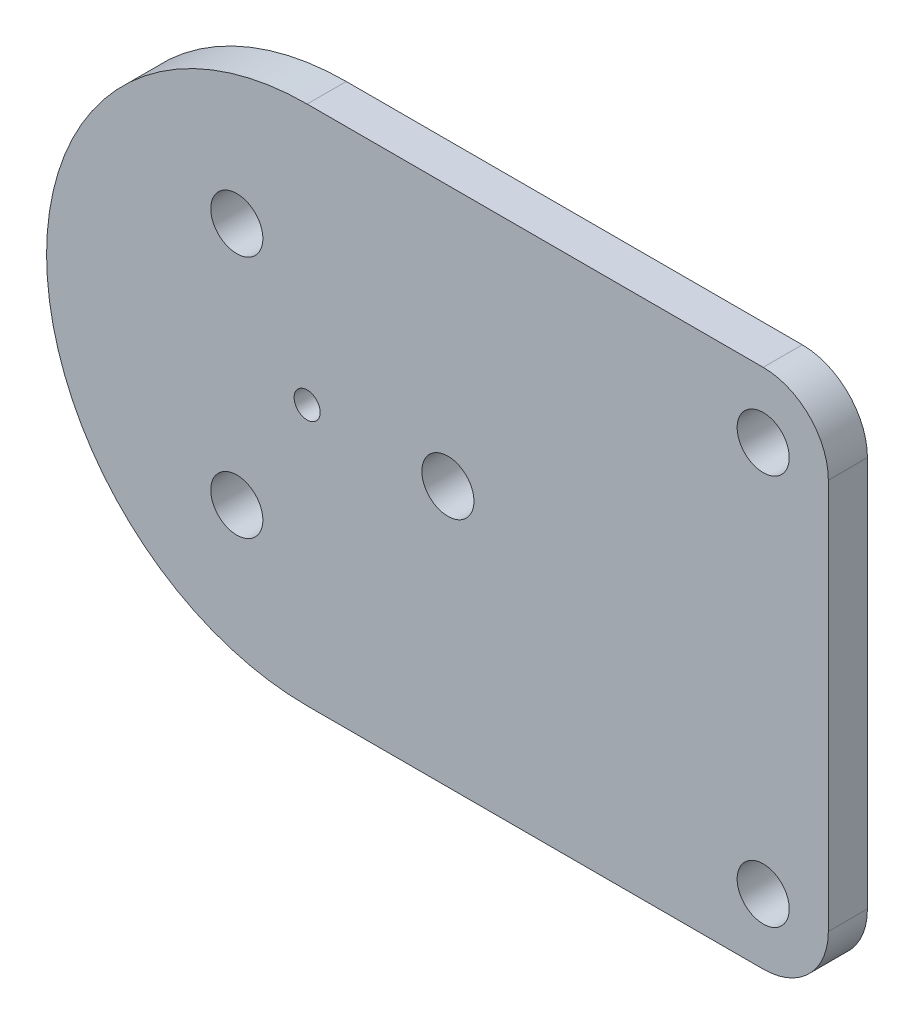
ISO-10303-21;
HEADER;
FILE_DESCRIPTION(('STEP AP214'),'2;1');
FILE_NAME('part.step','',(''),(''),'','','');
FILE_SCHEMA(('AUTOMOTIVE_DESIGN { 1 0 10303 214 1 1 1 1 }'));
ENDSEC;
DATA;
#1=APPLICATION_CONTEXT('core data for automotive mechanical design processes');
#2=APPLICATION_PROTOCOL_DEFINITION('international standard','automotive_design',2000,#1);
#3=PRODUCT_CONTEXT('',#1,'mechanical');
#4=PRODUCT('Part','Part','',(#3));
#5=PRODUCT_RELATED_PRODUCT_CATEGORY('part','',(#4));
#6=PRODUCT_DEFINITION_FORMATION('','',#4);
#7=PRODUCT_DEFINITION_CONTEXT('part definition',#1,'design');
#8=PRODUCT_DEFINITION('design','',#6,#7);
#9=PRODUCT_DEFINITION_SHAPE('','',#8);
#10=(LENGTH_UNIT() NAMED_UNIT(*) SI_UNIT(.MILLI.,.METRE.));
#11=(NAMED_UNIT(*) PLANE_ANGLE_UNIT() SI_UNIT($,.RADIAN.));
#12=(NAMED_UNIT(*) SI_UNIT($,.STERADIAN.) SOLID_ANGLE_UNIT());
#13=UNCERTAINTY_MEASURE_WITH_UNIT(LENGTH_MEASURE(1.E-05),#10,'distance_accuracy_value','');
#14=(GEOMETRIC_REPRESENTATION_CONTEXT(3) GLOBAL_UNCERTAINTY_ASSIGNED_CONTEXT((#13)) GLOBAL_UNIT_ASSIGNED_CONTEXT((#10,
#11,#12)) REPRESENTATION_CONTEXT('',''));
#15=CARTESIAN_POINT('',(0.,0.,0.));
#16=DIRECTION('',(0.,0.,1.));
#17=DIRECTION('',(1.,0.,0.));
#18=AXIS2_PLACEMENT_3D('',#15,#16,#17);
#19=CARTESIAN_POINT('',(0.,-20.,3.));
#20=DIRECTION('',(0.,1.,0.));
#21=DIRECTION('',(0.,0.,1.));
#22=AXIS2_PLACEMENT_3D('',#19,#20,#21);
#23=PLANE('',#22);
#24=DIRECTION('',(1.,0.,0.));
#25=VECTOR('',#24,1.);
#26=CARTESIAN_POINT('',(0.,-20.,0.));
#27=LINE('',#26,#25);
#28=CARTESIAN_POINT('',(0.,-20.,0.));
#29=VERTEX_POINT('',#28);
#30=CARTESIAN_POINT('',(35.,-20.,0.));
#31=VERTEX_POINT('',#30);
#32=EDGE_CURVE('E147',#29,#31,#27,.T.);
#33=ORIENTED_EDGE('',*,*,#32,.T.);
#34=DIRECTION('',(0.,0.,-1.));
#35=VECTOR('',#34,1.);
#36=CARTESIAN_POINT('',(35.,-20.,3.));
#37=LINE('',#36,#35);
#38=CARTESIAN_POINT('',(35.,-20.,3.));
#39=VERTEX_POINT('',#38);
#40=EDGE_CURVE('E68',#31,#39,#37,.F.);
#41=ORIENTED_EDGE('',*,*,#40,.T.);
#42=DIRECTION('',(1.,0.,0.));
#43=VECTOR('',#42,1.);
#44=CARTESIAN_POINT('',(0.,-20.,3.));
#45=LINE('',#44,#43);
#46=CARTESIAN_POINT('',(0.,-20.,3.));
#47=VERTEX_POINT('',#46);
#48=EDGE_CURVE('E134',#47,#39,#45,.T.);
#49=ORIENTED_EDGE('',*,*,#48,.F.);
#50=DIRECTION('',(0.,0.,-1.));
#51=VECTOR('',#50,1.);
#52=CARTESIAN_POINT('',(0.,-20.,3.));
#53=LINE('',#52,#51);
#54=EDGE_CURVE('E116',#47,#29,#53,.T.);
#55=ORIENTED_EDGE('',*,*,#54,.T.);
#56=EDGE_LOOP('',(#33,#41,#49,#55));
#57=FACE_BOUND('',#56,.T.);
#58=ADVANCED_FACE('F45',(#57),#23,.F.);
#59=CARTESIAN_POINT('',(40.,0.,3.));
#60=DIRECTION('',(1.,0.,0.));
#61=DIRECTION('',(0.,0.,-1.));
#62=AXIS2_PLACEMENT_3D('',#59,#60,#61);
#63=PLANE('',#62);
#64=DIRECTION('',(0.,-1.,0.));
#65=VECTOR('',#64,1.);
#66=CARTESIAN_POINT('',(40.,0.,3.));
#67=LINE('',#66,#65);
#68=CARTESIAN_POINT('',(40.,15.,3.));
#69=VERTEX_POINT('',#68);
#70=CARTESIAN_POINT('',(40.,-15.,3.));
#71=VERTEX_POINT('',#70);
#72=EDGE_CURVE('E128',#69,#71,#67,.T.);
#73=ORIENTED_EDGE('',*,*,#72,.T.);
#74=DIRECTION('',(0.,0.,-1.));
#75=VECTOR('',#74,1.);
#76=CARTESIAN_POINT('',(40.,-15.,0.));
#77=LINE('',#76,#75);
#78=CARTESIAN_POINT('',(40.,-15.,0.));
#79=VERTEX_POINT('',#78);
#80=EDGE_CURVE('E171',#71,#79,#77,.T.);
#81=ORIENTED_EDGE('',*,*,#80,.T.);
#82=DIRECTION('',(0.,-1.,0.));
#83=VECTOR('',#82,1.);
#84=CARTESIAN_POINT('',(40.,0.,0.));
#85=LINE('',#84,#83);
#86=CARTESIAN_POINT('',(40.,15.,0.));
#87=VERTEX_POINT('',#86);
#88=EDGE_CURVE('E150',#87,#79,#85,.T.);
#89=ORIENTED_EDGE('',*,*,#88,.F.);
#90=DIRECTION('',(0.,0.,-1.));
#91=VECTOR('',#90,1.);
#92=CARTESIAN_POINT('',(40.,15.,3.));
#93=LINE('',#92,#91);
#94=EDGE_CURVE('E115',#87,#69,#93,.F.);
#95=ORIENTED_EDGE('',*,*,#94,.T.);
#96=EDGE_LOOP('',(#73,#81,#89,#95));
#97=FACE_BOUND('',#96,.T.);
#98=ADVANCED_FACE('F183',(#97),#63,.T.);
#99=CARTESIAN_POINT('',(0.,20.,3.));
#100=DIRECTION('',(0.,1.,0.));
#101=DIRECTION('',(0.,0.,1.));
#102=AXIS2_PLACEMENT_3D('',#99,#100,#101);
#103=PLANE('',#102);
#104=DIRECTION('',(1.,0.,0.));
#105=VECTOR('',#104,1.);
#106=CARTESIAN_POINT('',(0.,20.,3.));
#107=LINE('',#106,#105);
#108=CARTESIAN_POINT('',(0.,20.,3.));
#109=VERTEX_POINT('',#108);
#110=CARTESIAN_POINT('',(35.,20.,3.));
#111=VERTEX_POINT('',#110);
#112=EDGE_CURVE('E108',#109,#111,#107,.T.);
#113=ORIENTED_EDGE('',*,*,#112,.T.);
#114=DIRECTION('',(0.,0.,-1.));
#115=VECTOR('',#114,1.);
#116=CARTESIAN_POINT('',(35.,20.,3.));
#117=LINE('',#116,#115);
#118=CARTESIAN_POINT('',(35.,20.,0.));
#119=VERTEX_POINT('',#118);
#120=EDGE_CURVE('E11',#111,#119,#117,.T.);
#121=ORIENTED_EDGE('',*,*,#120,.T.);
#122=DIRECTION('',(1.,0.,0.));
#123=VECTOR('',#122,1.);
#124=CARTESIAN_POINT('',(0.,20.,0.));
#125=LINE('',#124,#123);
#126=CARTESIAN_POINT('',(0.,20.,0.));
#127=VERTEX_POINT('',#126);
#128=EDGE_CURVE('E111',#127,#119,#125,.T.);
#129=ORIENTED_EDGE('',*,*,#128,.F.);
#130=DIRECTION('',(0.,0.,-1.));
#131=VECTOR('',#130,1.);
#132=CARTESIAN_POINT('',(0.,20.,3.));
#133=LINE('',#132,#131);
#134=EDGE_CURVE('E105',#109,#127,#133,.T.);
#135=ORIENTED_EDGE('',*,*,#134,.F.);
#136=EDGE_LOOP('',(#113,#121,#129,#135));
#137=FACE_BOUND('',#136,.T.);
#138=ADVANCED_FACE('F107',(#137),#103,.T.);
#139=CARTESIAN_POINT('',(35.,-15.,3.));
#140=DIRECTION('',(0.,0.,-1.));
#141=DIRECTION('',(-1.,0.,0.));
#142=AXIS2_PLACEMENT_3D('',#139,#140,#141);
#143=CYLINDRICAL_SURFACE('',#142,2.);
#144=CARTESIAN_POINT('',(35.,-15.,3.));
#145=DIRECTION('',(0.,0.,1.));
#146=DIRECTION('',(1.,0.,0.));
#147=AXIS2_PLACEMENT_3D('',#144,#145,#146);
#148=CIRCLE('',#147,2.);
#149=CARTESIAN_POINT('',(37.,-15.,3.));
#150=VERTEX_POINT('',#149);
#151=EDGE_CURVE('E141',#150,#150,#148,.T.);
#152=ORIENTED_EDGE('',*,*,#151,.T.);
#153=EDGE_LOOP('',(#152));
#154=FACE_BOUND('',#153,.T.);
#155=CARTESIAN_POINT('',(35.,-15.,0.));
#156=DIRECTION('',(0.,0.,1.));
#157=DIRECTION('',(1.,0.,0.));
#158=AXIS2_PLACEMENT_3D('',#155,#156,#157);
#159=CIRCLE('',#158,2.);
#160=CARTESIAN_POINT('',(37.,-15.,0.));
#161=VERTEX_POINT('',#160);
#162=EDGE_CURVE('E162',#161,#161,#159,.T.);
#163=ORIENTED_EDGE('',*,*,#162,.F.);
#164=EDGE_LOOP('',(#163));
#165=FACE_BOUND('',#164,.T.);
#166=ADVANCED_FACE('F293',(#154,#165),#143,.F.);
#167=CARTESIAN_POINT('',(0.,0.,3.));
#168=DIRECTION('',(0.,0.,-1.));
#169=DIRECTION('',(-1.,0.,0.));
#170=AXIS2_PLACEMENT_3D('',#167,#168,#169);
#171=CYLINDRICAL_SURFACE('',#170,1.);
#172=CARTESIAN_POINT('',(0.,0.,3.));
#173=DIRECTION('',(0.,0.,1.));
#174=DIRECTION('',(1.,0.,0.));
#175=AXIS2_PLACEMENT_3D('',#172,#173,#174);
#176=CIRCLE('',#175,1.);
#177=CARTESIAN_POINT('',(1.,0.,3.));
#178=VERTEX_POINT('',#177);
#179=EDGE_CURVE('E123',#178,#178,#176,.T.);
#180=ORIENTED_EDGE('',*,*,#179,.T.);
#181=EDGE_LOOP('',(#180));
#182=FACE_BOUND('',#181,.T.);
#183=CARTESIAN_POINT('',(0.,0.,0.));
#184=DIRECTION('',(0.,0.,1.));
#185=DIRECTION('',(1.,0.,0.));
#186=AXIS2_PLACEMENT_3D('',#183,#184,#185);
#187=CIRCLE('',#186,1.);
#188=CARTESIAN_POINT('',(1.,0.,0.));
#189=VERTEX_POINT('',#188);
#190=EDGE_CURVE('E158',#189,#189,#187,.T.);
#191=ORIENTED_EDGE('',*,*,#190,.F.);
#192=EDGE_LOOP('',(#191));
#193=FACE_BOUND('',#192,.T.);
#194=ADVANCED_FACE('F344',(#182,#193),#171,.F.);
#195=CARTESIAN_POINT('',(0.,0.,3.));
#196=DIRECTION('',(0.,0.,-1.));
#197=DIRECTION('',(-1.,0.,0.));
#198=AXIS2_PLACEMENT_3D('',#195,#196,#197);
#199=CYLINDRICAL_SURFACE('',#198,20.);
#200=CARTESIAN_POINT('',(0.,0.,0.));
#201=DIRECTION('',(0.,0.,1.));
#202=DIRECTION('',(1.,0.,0.));
#203=AXIS2_PLACEMENT_3D('',#200,#201,#202);
#204=CIRCLE('',#203,20.);
#205=EDGE_CURVE('E155',#127,#29,#204,.T.);
#206=ORIENTED_EDGE('',*,*,#205,.T.);
#207=ORIENTED_EDGE('',*,*,#54,.F.);
#208=CARTESIAN_POINT('',(0.,0.,3.));
#209=DIRECTION('',(0.,0.,1.));
#210=DIRECTION('',(1.,0.,0.));
#211=AXIS2_PLACEMENT_3D('',#208,#209,#210);
#212=CIRCLE('',#211,20.);
#213=EDGE_CURVE('E119',#109,#47,#212,.T.);
#214=ORIENTED_EDGE('',*,*,#213,.F.);
#215=ORIENTED_EDGE('',*,*,#134,.T.);
#216=EDGE_LOOP('',(#206,#207,#214,#215));
#217=FACE_BOUND('',#216,.T.);
#218=ADVANCED_FACE('F120',(#217),#199,.T.);
#219=CARTESIAN_POINT('',(35.,15.,3.));
#220=DIRECTION('',(0.,0.,-1.));
#221=DIRECTION('',(-1.,0.,0.));
#222=AXIS2_PLACEMENT_3D('',#219,#220,#221);
#223=CYLINDRICAL_SURFACE('',#222,2.);
#224=CARTESIAN_POINT('',(35.,15.,3.));
#225=DIRECTION('',(0.,0.,1.));
#226=DIRECTION('',(1.,0.,0.));
#227=AXIS2_PLACEMENT_3D('',#224,#225,#226);
#228=CIRCLE('',#227,2.);
#229=CARTESIAN_POINT('',(37.,15.,3.));
#230=VERTEX_POINT('',#229);
#231=EDGE_CURVE('E144',#230,#230,#228,.F.);
#232=ORIENTED_EDGE('',*,*,#231,.F.);
#233=EDGE_LOOP('',(#232));
#234=FACE_BOUND('',#233,.T.);
#235=CARTESIAN_POINT('',(35.,15.,0.));
#236=DIRECTION('',(0.,0.,1.));
#237=DIRECTION('',(1.,0.,0.));
#238=AXIS2_PLACEMENT_3D('',#235,#236,#237);
#239=CIRCLE('',#238,2.);
#240=CARTESIAN_POINT('',(37.,15.,0.));
#241=VERTEX_POINT('',#240);
#242=EDGE_CURVE('E165',#241,#241,#239,.F.);
#243=ORIENTED_EDGE('',*,*,#242,.T.);
#244=EDGE_LOOP('',(#243));
#245=FACE_BOUND('',#244,.T.);
#246=ADVANCED_FACE('F283',(#234,#245),#223,.F.);
#247=CARTESIAN_POINT('',(0.,0.,3.));
#248=DIRECTION('',(0.,0.,1.));
#249=DIRECTION('',(1.,0.,0.));
#250=AXIS2_PLACEMENT_3D('',#247,#248,#249);
#251=PLANE('',#250);
#252=CARTESIAN_POINT('',(10.8,0.,3.));
#253=DIRECTION('',(0.,0.,-1.));
#254=DIRECTION('',(-1.,0.,0.));
#255=AXIS2_PLACEMENT_3D('',#252,#253,#254);
#256=CIRCLE('',#255,2.);
#257=CARTESIAN_POINT('',(8.8,0.,3.));
#258=VERTEX_POINT('',#257);
#259=EDGE_CURVE('E151',#258,#258,#256,.T.);
#260=ORIENTED_EDGE('',*,*,#259,.T.);
#261=EDGE_LOOP('',(#260));
#262=FACE_BOUND('',#261,.T.);
#263=CARTESIAN_POINT('',(-5.40000000000005,9.35307436087191,3.));
#264=DIRECTION('',(0.,0.,-1.));
#265=DIRECTION('',(-1.,0.,0.));
#266=AXIS2_PLACEMENT_3D('',#263,#264,#265);
#267=CIRCLE('',#266,2.);
#268=CARTESIAN_POINT('',(-7.40000000000005,9.35307436087191,3.));
#269=VERTEX_POINT('',#268);
#270=EDGE_CURVE('E201',#269,#269,#267,.T.);
#271=ORIENTED_EDGE('',*,*,#270,.T.);
#272=EDGE_LOOP('',(#271));
#273=FACE_BOUND('',#272,.T.);
#274=CARTESIAN_POINT('',(-5.39999999999992,-9.35307436087199,3.));
#275=DIRECTION('',(0.,0.,-1.));
#276=DIRECTION('',(-1.,0.,0.));
#277=AXIS2_PLACEMENT_3D('',#274,#275,#276);
#278=CIRCLE('',#277,2.);
#279=CARTESIAN_POINT('',(-7.39999999999992,-9.35307436087199,3.));
#280=VERTEX_POINT('',#279);
#281=EDGE_CURVE('E193',#280,#280,#278,.T.);
#282=ORIENTED_EDGE('',*,*,#281,.T.);
#283=EDGE_LOOP('',(#282));
#284=FACE_BOUND('',#283,.T.);
#285=ORIENTED_EDGE('',*,*,#48,.T.);
#286=CARTESIAN_POINT('',(35.,-15.,3.));
#287=DIRECTION('',(0.,0.,1.));
#288=DIRECTION('',(1.,0.,0.));
#289=AXIS2_PLACEMENT_3D('',#286,#287,#288);
#290=CIRCLE('',#289,5.);
#291=EDGE_CURVE('E53',#39,#71,#290,.T.);
#292=ORIENTED_EDGE('',*,*,#291,.T.);
#293=ORIENTED_EDGE('',*,*,#72,.F.);
#294=CARTESIAN_POINT('',(35.,15.,3.));
#295=DIRECTION('',(0.,0.,1.));
#296=DIRECTION('',(1.,0.,0.));
#297=AXIS2_PLACEMENT_3D('',#294,#295,#296);
#298=CIRCLE('',#297,5.);
#299=EDGE_CURVE('E60',#69,#111,#298,.T.);
#300=ORIENTED_EDGE('',*,*,#299,.T.);
#301=ORIENTED_EDGE('',*,*,#112,.F.);
#302=ORIENTED_EDGE('',*,*,#213,.T.);
#303=EDGE_LOOP('',(#285,#292,#293,#300,#301,#302));
#304=FACE_BOUND('',#303,.T.);
#305=ORIENTED_EDGE('',*,*,#179,.F.);
#306=EDGE_LOOP('',(#305));
#307=FACE_BOUND('',#306,.T.);
#308=ORIENTED_EDGE('',*,*,#151,.F.);
#309=EDGE_LOOP('',(#308));
#310=FACE_BOUND('',#309,.T.);
#311=ORIENTED_EDGE('',*,*,#231,.T.);
#312=EDGE_LOOP('',(#311));
#313=FACE_BOUND('',#312,.T.);
#314=ADVANCED_FACE('F125',(#262,#273,#284,#304,#307,#310,#313),#251,.T.);
#315=CARTESIAN_POINT('',(0.,0.,0.));
#316=DIRECTION('',(0.,0.,1.));
#317=DIRECTION('',(1.,0.,0.));
#318=AXIS2_PLACEMENT_3D('',#315,#316,#317);
#319=PLANE('',#318);
#320=CARTESIAN_POINT('',(10.8,0.,0.));
#321=DIRECTION('',(0.,0.,-1.));
#322=DIRECTION('',(-1.,0.,0.));
#323=AXIS2_PLACEMENT_3D('',#320,#321,#322);
#324=CIRCLE('',#323,2.);
#325=CARTESIAN_POINT('',(8.8,0.,0.));
#326=VERTEX_POINT('',#325);
#327=EDGE_CURVE('E209',#326,#326,#324,.T.);
#328=ORIENTED_EDGE('',*,*,#327,.F.);
#329=EDGE_LOOP('',(#328));
#330=FACE_BOUND('',#329,.T.);
#331=CARTESIAN_POINT('',(-5.40000000000005,9.35307436087191,0.));
#332=DIRECTION('',(0.,0.,-1.));
#333=DIRECTION('',(-1.,0.,0.));
#334=AXIS2_PLACEMENT_3D('',#331,#332,#333);
#335=CIRCLE('',#334,2.);
#336=CARTESIAN_POINT('',(-7.40000000000005,9.35307436087191,0.));
#337=VERTEX_POINT('',#336);
#338=EDGE_CURVE('E205',#337,#337,#335,.T.);
#339=ORIENTED_EDGE('',*,*,#338,.F.);
#340=EDGE_LOOP('',(#339));
#341=FACE_BOUND('',#340,.T.);
#342=CARTESIAN_POINT('',(-5.39999999999992,-9.35307436087199,0.));
#343=DIRECTION('',(0.,0.,-1.));
#344=DIRECTION('',(-1.,0.,0.));
#345=AXIS2_PLACEMENT_3D('',#342,#343,#344);
#346=CIRCLE('',#345,2.);
#347=CARTESIAN_POINT('',(-7.39999999999992,-9.35307436087199,0.));
#348=VERTEX_POINT('',#347);
#349=EDGE_CURVE('E197',#348,#348,#346,.T.);
#350=ORIENTED_EDGE('',*,*,#349,.F.);
#351=EDGE_LOOP('',(#350));
#352=FACE_BOUND('',#351,.T.);
#353=ORIENTED_EDGE('',*,*,#88,.T.);
#354=CARTESIAN_POINT('',(35.,-15.,0.));
#355=DIRECTION('',(0.,0.,1.));
#356=DIRECTION('',(1.,0.,0.));
#357=AXIS2_PLACEMENT_3D('',#354,#355,#356);
#358=CIRCLE('',#357,5.);
#359=EDGE_CURVE('E176',#79,#31,#358,.F.);
#360=ORIENTED_EDGE('',*,*,#359,.T.);
#361=ORIENTED_EDGE('',*,*,#32,.F.);
#362=ORIENTED_EDGE('',*,*,#205,.F.);
#363=ORIENTED_EDGE('',*,*,#128,.T.);
#364=CARTESIAN_POINT('',(35.,15.,0.));
#365=DIRECTION('',(0.,0.,1.));
#366=DIRECTION('',(1.,0.,0.));
#367=AXIS2_PLACEMENT_3D('',#364,#365,#366);
#368=CIRCLE('',#367,5.);
#369=EDGE_CURVE('E174',#119,#87,#368,.F.);
#370=ORIENTED_EDGE('',*,*,#369,.T.);
#371=EDGE_LOOP('',(#353,#360,#361,#362,#363,#370));
#372=FACE_BOUND('',#371,.T.);
#373=ORIENTED_EDGE('',*,*,#190,.T.);
#374=EDGE_LOOP('',(#373));
#375=FACE_BOUND('',#374,.T.);
#376=ORIENTED_EDGE('',*,*,#162,.T.);
#377=EDGE_LOOP('',(#376));
#378=FACE_BOUND('',#377,.T.);
#379=ORIENTED_EDGE('',*,*,#242,.F.);
#380=EDGE_LOOP('',(#379));
#381=FACE_BOUND('',#380,.T.);
#382=ADVANCED_FACE('F189',(#330,#341,#352,#372,#375,#378,#381),#319,.F.);
#383=CARTESIAN_POINT('',(-5.39999999999992,-9.35307436087199,3.));
#384=DIRECTION('',(0.,0.,-1.));
#385=DIRECTION('',(-1.,0.,0.));
#386=AXIS2_PLACEMENT_3D('',#383,#384,#385);
#387=CYLINDRICAL_SURFACE('',#386,2.);
#388=ORIENTED_EDGE('',*,*,#281,.F.);
#389=EDGE_LOOP('',(#388));
#390=FACE_BOUND('',#389,.T.);
#391=ORIENTED_EDGE('',*,*,#349,.T.);
#392=EDGE_LOOP('',(#391));
#393=FACE_BOUND('',#392,.T.);
#394=ADVANCED_FACE('F228',(#390,#393),#387,.F.);
#395=CARTESIAN_POINT('',(-5.40000000000005,9.35307436087191,3.));
#396=DIRECTION('',(0.,0.,-1.));
#397=DIRECTION('',(-1.,0.,0.));
#398=AXIS2_PLACEMENT_3D('',#395,#396,#397);
#399=CYLINDRICAL_SURFACE('',#398,2.);
#400=ORIENTED_EDGE('',*,*,#270,.F.);
#401=EDGE_LOOP('',(#400));
#402=FACE_BOUND('',#401,.T.);
#403=ORIENTED_EDGE('',*,*,#338,.T.);
#404=EDGE_LOOP('',(#403));
#405=FACE_BOUND('',#404,.T.);
#406=ADVANCED_FACE('F222',(#402,#405),#399,.F.);
#407=CARTESIAN_POINT('',(10.8,0.,3.));
#408=DIRECTION('',(0.,0.,-1.));
#409=DIRECTION('',(-1.,0.,0.));
#410=AXIS2_PLACEMENT_3D('',#407,#408,#409);
#411=CYLINDRICAL_SURFACE('',#410,2.);
#412=ORIENTED_EDGE('',*,*,#259,.F.);
#413=EDGE_LOOP('',(#412));
#414=FACE_BOUND('',#413,.T.);
#415=ORIENTED_EDGE('',*,*,#327,.T.);
#416=EDGE_LOOP('',(#415));
#417=FACE_BOUND('',#416,.T.);
#418=ADVANCED_FACE('F219',(#414,#417),#411,.F.);
#419=CARTESIAN_POINT('',(35.,-15.,3.));
#420=DIRECTION('',(0.,0.,1.));
#421=DIRECTION('',(1.,0.,0.));
#422=AXIS2_PLACEMENT_3D('',#419,#420,#421);
#423=CYLINDRICAL_SURFACE('',#422,5.);
#424=ORIENTED_EDGE('',*,*,#291,.F.);
#425=ORIENTED_EDGE('',*,*,#40,.F.);
#426=ORIENTED_EDGE('',*,*,#359,.F.);
#427=ORIENTED_EDGE('',*,*,#80,.F.);
#428=EDGE_LOOP('',(#424,#425,#426,#427));
#429=FACE_BOUND('',#428,.T.);
#430=ADVANCED_FACE('F186',(#429),#423,.T.);
#431=CARTESIAN_POINT('',(35.,15.,3.));
#432=DIRECTION('',(0.,0.,-1.));
#433=DIRECTION('',(-1.,0.,0.));
#434=AXIS2_PLACEMENT_3D('',#431,#432,#433);
#435=CYLINDRICAL_SURFACE('',#434,5.);
#436=ORIENTED_EDGE('',*,*,#299,.F.);
#437=ORIENTED_EDGE('',*,*,#94,.F.);
#438=ORIENTED_EDGE('',*,*,#369,.F.);
#439=ORIENTED_EDGE('',*,*,#120,.F.);
#440=EDGE_LOOP('',(#436,#437,#438,#439));
#441=FACE_BOUND('',#440,.T.);
#442=ADVANCED_FACE('F47',(#441),#435,.T.);
#443=CLOSED_SHELL('',(#58,#98,#138,#166,#194,#218,#246,#314,#382,#394,#406,#418,#430,#442));
#444=MANIFOLD_SOLID_BREP('B2',#443);
#445=ADVANCED_BREP_SHAPE_REPRESENTATION('',(#18,#444),#14);
#446=SHAPE_DEFINITION_REPRESENTATION(#9,#445);
ENDSEC;
END-ISO-10303-21;
